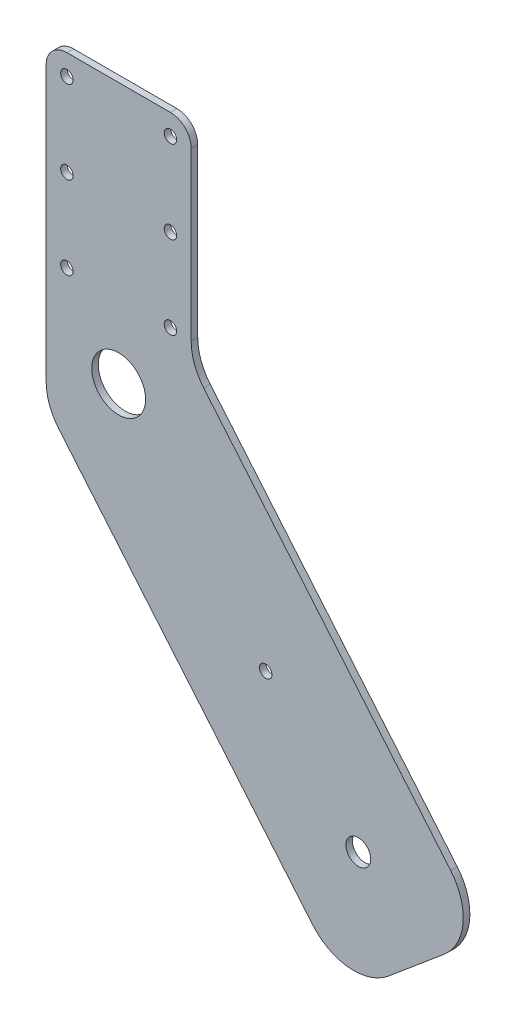
ISO-10303-21;
HEADER;
FILE_DESCRIPTION(('STEP AP214'),'2;1');
FILE_NAME('part.step','',(''),(''),'','','');
FILE_SCHEMA(('AUTOMOTIVE_DESIGN { 1 0 10303 214 1 1 1 1 }'));
ENDSEC;
DATA;
#1=APPLICATION_CONTEXT('core data for automotive mechanical design processes');
#2=APPLICATION_PROTOCOL_DEFINITION('international standard','automotive_design',2000,#1);
#3=PRODUCT_CONTEXT('',#1,'mechanical');
#4=PRODUCT('Part','Part','',(#3));
#5=PRODUCT_RELATED_PRODUCT_CATEGORY('part','',(#4));
#6=PRODUCT_DEFINITION_FORMATION('','',#4);
#7=PRODUCT_DEFINITION_CONTEXT('part definition',#1,'design');
#8=PRODUCT_DEFINITION('design','',#6,#7);
#9=PRODUCT_DEFINITION_SHAPE('','',#8);
#10=(LENGTH_UNIT() NAMED_UNIT(*) SI_UNIT(.MILLI.,.METRE.));
#11=(NAMED_UNIT(*) PLANE_ANGLE_UNIT() SI_UNIT($,.RADIAN.));
#12=(NAMED_UNIT(*) SI_UNIT($,.STERADIAN.) SOLID_ANGLE_UNIT());
#13=UNCERTAINTY_MEASURE_WITH_UNIT(LENGTH_MEASURE(1.E-05),#10,'distance_accuracy_value','');
#14=(GEOMETRIC_REPRESENTATION_CONTEXT(3) GLOBAL_UNCERTAINTY_ASSIGNED_CONTEXT((#13)) GLOBAL_UNIT_ASSIGNED_CONTEXT((#10,
#11,#12)) REPRESENTATION_CONTEXT('',''));
#15=CARTESIAN_POINT('',(0.,0.,0.));
#16=DIRECTION('',(0.,0.,1.));
#17=DIRECTION('',(1.,0.,0.));
#18=AXIS2_PLACEMENT_3D('',#15,#16,#17);
#19=CARTESIAN_POINT('',(0.,0.,1.5875));
#20=DIRECTION('',(0.,0.,1.));
#21=DIRECTION('',(1.,0.,0.));
#22=AXIS2_PLACEMENT_3D('',#19,#20,#21);
#23=PLANE('',#22);
#24=CARTESIAN_POINT('',(53.0049557524877,-55.3131585729256,1.5875));
#25=DIRECTION('',(0.,0.,1.));
#26=DIRECTION('',(1.,0.,0.));
#27=AXIS2_PLACEMENT_3D('',#24,#25,#26);
#28=CIRCLE('',#27,1.5);
#29=CARTESIAN_POINT('',(54.5049557524877,-55.3131585729256,1.5875));
#30=VERTEX_POINT('',#29);
#31=EDGE_CURVE('E500',#30,#30,#28,.T.);
#32=ORIENTED_EDGE('',*,*,#31,.F.);
#33=EDGE_LOOP('',(#32));
#34=FACE_BOUND('',#33,.T.);
#35=CARTESIAN_POINT('',(30.,25.,1.5875));
#36=DIRECTION('',(0.,0.,1.));
#37=DIRECTION('',(-1.,0.,0.));
#38=AXIS2_PLACEMENT_3D('',#35,#36,#37);
#39=CIRCLE('',#38,1.5);
#40=CARTESIAN_POINT('',(28.5,25.,1.5875));
#41=VERTEX_POINT('',#40);
#42=EDGE_CURVE('E488',#41,#41,#39,.T.);
#43=ORIENTED_EDGE('',*,*,#42,.F.);
#44=EDGE_LOOP('',(#43));
#45=FACE_BOUND('',#44,.T.);
#46=CARTESIAN_POINT('',(5.00000000000001,5.,1.5875));
#47=DIRECTION('',(0.,0.,1.));
#48=DIRECTION('',(1.,0.,0.));
#49=AXIS2_PLACEMENT_3D('',#46,#47,#48);
#50=CIRCLE('',#49,1.5);
#51=CARTESIAN_POINT('',(6.50000000000001,5.,1.5875));
#52=VERTEX_POINT('',#51);
#53=EDGE_CURVE('E476',#52,#52,#50,.T.);
#54=ORIENTED_EDGE('',*,*,#53,.F.);
#55=EDGE_LOOP('',(#54));
#56=FACE_BOUND('',#55,.T.);
#57=CARTESIAN_POINT('',(5.,45.,1.5875));
#58=DIRECTION('',(0.,0.,1.));
#59=DIRECTION('',(1.,0.,0.));
#60=AXIS2_PLACEMENT_3D('',#57,#58,#59);
#61=CIRCLE('',#60,1.5);
#62=CARTESIAN_POINT('',(6.5,45.,1.5875));
#63=VERTEX_POINT('',#62);
#64=EDGE_CURVE('E464',#63,#63,#61,.T.);
#65=ORIENTED_EDGE('',*,*,#64,.F.);
#66=EDGE_LOOP('',(#65));
#67=FACE_BOUND('',#66,.T.);
#68=DIRECTION('',(0.64278760968654,-0.766044443118977,0.));
#69=VECTOR('',#68,1.);
#70=CARTESIAN_POINT('',(0.,-26.,1.5875));
#71=LINE('',#70,#69);
#72=CARTESIAN_POINT('',(3.0414222394533,-29.6246258804644,1.5875));
#73=VERTEX_POINT('',#72);
#74=CARTESIAN_POINT('',(64.3123286807204,-102.644448753348,1.5875));
#75=VERTEX_POINT('',#74);
#76=EDGE_CURVE('E283',#73,#75,#71,.T.);
#77=ORIENTED_EDGE('',*,*,#76,.T.);
#78=CARTESIAN_POINT('',(74.2709064412671,-94.288209827423,1.5875));
#79=DIRECTION('',(0.,0.,1.));
#80=DIRECTION('',(1.,0.,0.));
#81=AXIS2_PLACEMENT_3D('',#78,#79,#80);
#82=CIRCLE('',#81,13.);
#83=CARTESIAN_POINT('',(82.6271453671922,-104.24678758797,1.5875));
#84=VERTEX_POINT('',#83);
#85=EDGE_CURVE('E188',#75,#84,#82,.T.);
#86=ORIENTED_EDGE('',*,*,#85,.T.);
#87=DIRECTION('',(0.766044443118977,0.64278760968654,0.));
#88=VECTOR('',#87,1.);
#89=CARTESIAN_POINT('',(72.6685676066454,-112.603026513895,1.5875));
#90=LINE('',#89,#88);
#91=CARTESIAN_POINT('',(96.0513337444287,-92.9825560717761,1.5875));
#92=VERTEX_POINT('',#91);
#93=EDGE_CURVE('E215',#84,#92,#90,.T.);
#94=ORIENTED_EDGE('',*,*,#93,.T.);
#95=CARTESIAN_POINT('',(87.6950948185036,-83.0239783112294,1.5875));
#96=DIRECTION('',(0.,0.,1.));
#97=DIRECTION('',(1.,0.,0.));
#98=AXIS2_PLACEMENT_3D('',#95,#96,#97);
#99=CIRCLE('',#98,13.);
#100=CARTESIAN_POINT('',(97.6536725790503,-74.6677393853044,1.5875));
#101=VERTEX_POINT('',#100);
#102=EDGE_CURVE('E54',#92,#101,#99,.T.);
#103=ORIENTED_EDGE('',*,*,#102,.T.);
#104=DIRECTION('',(-0.64278760968654,0.766044443118978,0.));
#105=VECTOR('',#104,1.);
#106=CARTESIAN_POINT('',(106.009911504975,-84.6263171458511,1.5875));
#107=LINE('',#106,#105);
#108=CARTESIAN_POINT('',(38.0414222394533,-3.62462588046436,1.5875));
#109=VERTEX_POINT('',#108);
#110=EDGE_CURVE('E210',#101,#109,#107,.T.);
#111=ORIENTED_EDGE('',*,*,#110,.T.);
#112=CARTESIAN_POINT('',(48.,4.73161304546064,1.5875));
#113=DIRECTION('',(0.,0.,1.));
#114=DIRECTION('',(1.,0.,0.));
#115=AXIS2_PLACEMENT_3D('',#112,#113,#114);
#116=CIRCLE('',#115,13.);
#117=CARTESIAN_POINT('',(35.,4.73161304546064,1.5875));
#118=VERTEX_POINT('',#117);
#119=EDGE_CURVE('E11',#109,#118,#116,.F.);
#120=ORIENTED_EDGE('',*,*,#119,.T.);
#121=DIRECTION('',(0.,1.,0.));
#122=VECTOR('',#121,1.);
#123=CARTESIAN_POINT('',(35.,50.,1.5875));
#124=LINE('',#123,#122);
#125=CARTESIAN_POINT('',(35.,45.,1.5875));
#126=VERTEX_POINT('',#125);
#127=EDGE_CURVE('E209',#118,#126,#124,.T.);
#128=ORIENTED_EDGE('',*,*,#127,.T.);
#129=CARTESIAN_POINT('',(30.,45.,1.5875));
#130=DIRECTION('',(0.,0.,1.));
#131=DIRECTION('',(1.,0.,0.));
#132=AXIS2_PLACEMENT_3D('',#129,#130,#131);
#133=CIRCLE('',#132,5.);
#134=CARTESIAN_POINT('',(30.,50.,1.5875));
#135=VERTEX_POINT('',#134);
#136=EDGE_CURVE('E164',#126,#135,#133,.T.);
#137=ORIENTED_EDGE('',*,*,#136,.T.);
#138=DIRECTION('',(-1.,0.,0.));
#139=VECTOR('',#138,1.);
#140=CARTESIAN_POINT('',(0.,50.,1.5875));
#141=LINE('',#140,#139);
#142=CARTESIAN_POINT('',(5.,50.,1.5875));
#143=VERTEX_POINT('',#142);
#144=EDGE_CURVE('E142',#135,#143,#141,.T.);
#145=ORIENTED_EDGE('',*,*,#144,.T.);
#146=CARTESIAN_POINT('',(5.,45.,1.5875));
#147=DIRECTION('',(0.,0.,1.));
#148=DIRECTION('',(1.,0.,0.));
#149=AXIS2_PLACEMENT_3D('',#146,#147,#148);
#150=CIRCLE('',#149,5.);
#151=CARTESIAN_POINT('',(0.,45.,1.5875));
#152=VERTEX_POINT('',#151);
#153=EDGE_CURVE('E162',#143,#152,#150,.T.);
#154=ORIENTED_EDGE('',*,*,#153,.T.);
#155=DIRECTION('',(0.,-1.,0.));
#156=VECTOR('',#155,1.);
#157=CARTESIAN_POINT('',(0.,0.,1.5875));
#158=LINE('',#157,#156);
#159=CARTESIAN_POINT('',(0.,-21.2683869545394,1.5875));
#160=VERTEX_POINT('',#159);
#161=EDGE_CURVE('E153',#152,#160,#158,.T.);
#162=ORIENTED_EDGE('',*,*,#161,.T.);
#163=CARTESIAN_POINT('',(13.,-21.2683869545394,1.5875));
#164=DIRECTION('',(0.,0.,1.));
#165=DIRECTION('',(1.,0.,0.));
#166=AXIS2_PLACEMENT_3D('',#163,#164,#165);
#167=CIRCLE('',#166,13.);
#168=EDGE_CURVE('E185',#160,#73,#167,.T.);
#169=ORIENTED_EDGE('',*,*,#168,.T.);
#170=EDGE_LOOP('',(#77,#86,#94,#103,#111,#120,#128,#137,#145,#154,#162,#169));
#171=FACE_BOUND('',#170,.T.);
#172=CARTESIAN_POINT('',(17.5,-13.,1.5875));
#173=DIRECTION('',(0.,0.,1.));
#174=DIRECTION('',(1.,0.,0.));
#175=AXIS2_PLACEMENT_3D('',#172,#173,#174);
#176=CIRCLE('',#175,6.50000000000001);
#177=CARTESIAN_POINT('',(24.,-13.,1.5875));
#178=VERTEX_POINT('',#177);
#179=EDGE_CURVE('E222',#178,#178,#176,.T.);
#180=ORIENTED_EDGE('',*,*,#179,.F.);
#181=EDGE_LOOP('',(#180));
#182=FACE_BOUND('',#181,.T.);
#183=CARTESIAN_POINT('',(5.,25.,1.5875));
#184=DIRECTION('',(0.,0.,1.));
#185=DIRECTION('',(1.,0.,0.));
#186=AXIS2_PLACEMENT_3D('',#183,#184,#185);
#187=CIRCLE('',#186,1.5);
#188=CARTESIAN_POINT('',(6.5,25.,1.5875));
#189=VERTEX_POINT('',#188);
#190=EDGE_CURVE('E470',#189,#189,#187,.T.);
#191=ORIENTED_EDGE('',*,*,#190,.F.);
#192=EDGE_LOOP('',(#191));
#193=FACE_BOUND('',#192,.T.);
#194=CARTESIAN_POINT('',(30.,5.00000000000001,1.5875));
#195=DIRECTION('',(0.,0.,1.));
#196=DIRECTION('',(-1.,0.,0.));
#197=AXIS2_PLACEMENT_3D('',#194,#195,#196);
#198=CIRCLE('',#197,1.5);
#199=CARTESIAN_POINT('',(28.5,5.00000000000001,1.5875));
#200=VERTEX_POINT('',#199);
#201=EDGE_CURVE('E482',#200,#200,#198,.T.);
#202=ORIENTED_EDGE('',*,*,#201,.F.);
#203=EDGE_LOOP('',(#202));
#204=FACE_BOUND('',#203,.T.);
#205=CARTESIAN_POINT('',(30.,45.,1.5875));
#206=DIRECTION('',(0.,0.,1.));
#207=DIRECTION('',(-1.,0.,0.));
#208=AXIS2_PLACEMENT_3D('',#205,#206,#207);
#209=CIRCLE('',#208,1.5);
#210=CARTESIAN_POINT('',(28.5,45.,1.5875));
#211=VERTEX_POINT('',#210);
#212=EDGE_CURVE('E494',#211,#211,#209,.T.);
#213=ORIENTED_EDGE('',*,*,#212,.F.);
#214=EDGE_LOOP('',(#213));
#215=FACE_BOUND('',#214,.T.);
#216=CARTESIAN_POINT('',(75.3508848717886,-81.9439998807079,1.5875));
#217=DIRECTION('',(0.,0.,1.));
#218=DIRECTION('',(1.,0.,0.));
#219=AXIS2_PLACEMENT_3D('',#216,#217,#218);
#220=CIRCLE('',#219,3.00000000000001);
#221=CARTESIAN_POINT('',(78.3508848717886,-81.9439998807079,1.5875));
#222=VERTEX_POINT('',#221);
#223=EDGE_CURVE('E506',#222,#222,#220,.T.);
#224=ORIENTED_EDGE('',*,*,#223,.F.);
#225=EDGE_LOOP('',(#224));
#226=FACE_BOUND('',#225,.T.);
#227=ADVANCED_FACE('F32',(#34,#45,#56,#67,#171,#182,#193,#204,#215,#226),#23,.T.);
#228=CARTESIAN_POINT('',(0.,0.,0.));
#229=DIRECTION('',(0.,0.,1.));
#230=DIRECTION('',(1.,0.,0.));
#231=AXIS2_PLACEMENT_3D('',#228,#229,#230);
#232=PLANE('',#231);
#233=DIRECTION('',(0.766044443118977,0.64278760968654,0.));
#234=VECTOR('',#233,1.);
#235=CARTESIAN_POINT('',(72.6685676066454,-112.603026513895,0.));
#236=LINE('',#235,#234);
#237=CARTESIAN_POINT('',(82.6271453671922,-104.24678758797,0.));
#238=VERTEX_POINT('',#237);
#239=CARTESIAN_POINT('',(96.0513337444287,-92.9825560717761,0.));
#240=VERTEX_POINT('',#239);
#241=EDGE_CURVE('E203',#238,#240,#236,.T.);
#242=ORIENTED_EDGE('',*,*,#241,.F.);
#243=CARTESIAN_POINT('',(74.2709064412671,-94.288209827423,0.));
#244=DIRECTION('',(0.,0.,1.));
#245=DIRECTION('',(1.,0.,0.));
#246=AXIS2_PLACEMENT_3D('',#243,#244,#245);
#247=CIRCLE('',#246,13.);
#248=CARTESIAN_POINT('',(64.3123286807204,-102.644448753348,0.));
#249=VERTEX_POINT('',#248);
#250=EDGE_CURVE('E178',#238,#249,#247,.F.);
#251=ORIENTED_EDGE('',*,*,#250,.T.);
#252=DIRECTION('',(0.64278760968654,-0.766044443118977,0.));
#253=VECTOR('',#252,1.);
#254=CARTESIAN_POINT('',(0.,-26.,0.));
#255=LINE('',#254,#253);
#256=CARTESIAN_POINT('',(3.0414222394533,-29.6246258804644,0.));
#257=VERTEX_POINT('',#256);
#258=EDGE_CURVE('E219',#257,#249,#255,.T.);
#259=ORIENTED_EDGE('',*,*,#258,.F.);
#260=CARTESIAN_POINT('',(13.,-21.2683869545394,0.));
#261=DIRECTION('',(0.,0.,1.));
#262=DIRECTION('',(1.,0.,0.));
#263=AXIS2_PLACEMENT_3D('',#260,#261,#262);
#264=CIRCLE('',#263,13.);
#265=CARTESIAN_POINT('',(0.,-21.2683869545394,0.));
#266=VERTEX_POINT('',#265);
#267=EDGE_CURVE('E174',#257,#266,#264,.F.);
#268=ORIENTED_EDGE('',*,*,#267,.T.);
#269=DIRECTION('',(0.,-1.,0.));
#270=VECTOR('',#269,1.);
#271=CARTESIAN_POINT('',(0.,0.,0.));
#272=LINE('',#271,#270);
#273=CARTESIAN_POINT('',(0.,45.,0.));
#274=VERTEX_POINT('',#273);
#275=EDGE_CURVE('E149',#274,#266,#272,.T.);
#276=ORIENTED_EDGE('',*,*,#275,.F.);
#277=CARTESIAN_POINT('',(5.,45.,0.));
#278=DIRECTION('',(0.,0.,1.));
#279=DIRECTION('',(1.,0.,0.));
#280=AXIS2_PLACEMENT_3D('',#277,#278,#279);
#281=CIRCLE('',#280,5.);
#282=CARTESIAN_POINT('',(5.,50.,0.));
#283=VERTEX_POINT('',#282);
#284=EDGE_CURVE('E133',#274,#283,#281,.F.);
#285=ORIENTED_EDGE('',*,*,#284,.T.);
#286=DIRECTION('',(-1.,0.,0.));
#287=VECTOR('',#286,1.);
#288=CARTESIAN_POINT('',(0.,50.,0.));
#289=LINE('',#288,#287);
#290=CARTESIAN_POINT('',(30.,50.,0.));
#291=VERTEX_POINT('',#290);
#292=EDGE_CURVE('E139',#291,#283,#289,.T.);
#293=ORIENTED_EDGE('',*,*,#292,.F.);
#294=CARTESIAN_POINT('',(30.,45.,0.));
#295=DIRECTION('',(0.,0.,1.));
#296=DIRECTION('',(1.,0.,0.));
#297=AXIS2_PLACEMENT_3D('',#294,#295,#296);
#298=CIRCLE('',#297,5.);
#299=CARTESIAN_POINT('',(35.,45.,0.));
#300=VERTEX_POINT('',#299);
#301=EDGE_CURVE('E123',#291,#300,#298,.F.);
#302=ORIENTED_EDGE('',*,*,#301,.T.);
#303=DIRECTION('',(0.,1.,0.));
#304=VECTOR('',#303,1.);
#305=CARTESIAN_POINT('',(35.,50.,0.));
#306=LINE('',#305,#304);
#307=CARTESIAN_POINT('',(35.,4.73161304546064,0.));
#308=VERTEX_POINT('',#307);
#309=EDGE_CURVE('E150',#308,#300,#306,.T.);
#310=ORIENTED_EDGE('',*,*,#309,.F.);
#311=CARTESIAN_POINT('',(48.,4.73161304546064,0.));
#312=DIRECTION('',(0.,0.,1.));
#313=DIRECTION('',(1.,0.,0.));
#314=AXIS2_PLACEMENT_3D('',#311,#312,#313);
#315=CIRCLE('',#314,13.);
#316=CARTESIAN_POINT('',(38.0414222394533,-3.62462588046436,0.));
#317=VERTEX_POINT('',#316);
#318=EDGE_CURVE('E40',#308,#317,#315,.T.);
#319=ORIENTED_EDGE('',*,*,#318,.T.);
#320=DIRECTION('',(-0.64278760968654,0.766044443118978,0.));
#321=VECTOR('',#320,1.);
#322=CARTESIAN_POINT('',(106.009911504975,-84.6263171458511,0.));
#323=LINE('',#322,#321);
#324=CARTESIAN_POINT('',(97.6536725790503,-74.6677393853044,0.));
#325=VERTEX_POINT('',#324);
#326=EDGE_CURVE('E155',#325,#317,#323,.T.);
#327=ORIENTED_EDGE('',*,*,#326,.F.);
#328=CARTESIAN_POINT('',(87.6950948185036,-83.0239783112294,0.));
#329=DIRECTION('',(0.,0.,1.));
#330=DIRECTION('',(1.,0.,0.));
#331=AXIS2_PLACEMENT_3D('',#328,#329,#330);
#332=CIRCLE('',#331,13.);
#333=EDGE_CURVE('E176',#325,#240,#332,.F.);
#334=ORIENTED_EDGE('',*,*,#333,.T.);
#335=EDGE_LOOP('',(#242,#251,#259,#268,#276,#285,#293,#302,#310,#319,#327,#334));
#336=FACE_BOUND('',#335,.T.);
#337=CARTESIAN_POINT('',(17.5,-13.,0.));
#338=DIRECTION('',(0.,0.,1.));
#339=DIRECTION('',(1.,0.,0.));
#340=AXIS2_PLACEMENT_3D('',#337,#338,#339);
#341=CIRCLE('',#340,6.50000000000001);
#342=CARTESIAN_POINT('',(24.,-13.,0.));
#343=VERTEX_POINT('',#342);
#344=EDGE_CURVE('E287',#343,#343,#341,.T.);
#345=ORIENTED_EDGE('',*,*,#344,.T.);
#346=EDGE_LOOP('',(#345));
#347=FACE_BOUND('',#346,.T.);
#348=CARTESIAN_POINT('',(5.,45.,0.));
#349=DIRECTION('',(0.,0.,1.));
#350=DIRECTION('',(1.,0.,0.));
#351=AXIS2_PLACEMENT_3D('',#348,#349,#350);
#352=CIRCLE('',#351,1.5);
#353=CARTESIAN_POINT('',(6.5,45.,0.));
#354=VERTEX_POINT('',#353);
#355=EDGE_CURVE('E466',#354,#354,#352,.T.);
#356=ORIENTED_EDGE('',*,*,#355,.T.);
#357=EDGE_LOOP('',(#356));
#358=FACE_BOUND('',#357,.T.);
#359=CARTESIAN_POINT('',(5.,25.,0.));
#360=DIRECTION('',(0.,0.,1.));
#361=DIRECTION('',(1.,0.,0.));
#362=AXIS2_PLACEMENT_3D('',#359,#360,#361);
#363=CIRCLE('',#362,1.5);
#364=CARTESIAN_POINT('',(6.5,25.,0.));
#365=VERTEX_POINT('',#364);
#366=EDGE_CURVE('E473',#365,#365,#363,.T.);
#367=ORIENTED_EDGE('',*,*,#366,.T.);
#368=EDGE_LOOP('',(#367));
#369=FACE_BOUND('',#368,.T.);
#370=CARTESIAN_POINT('',(5.00000000000001,5.,0.));
#371=DIRECTION('',(0.,0.,1.));
#372=DIRECTION('',(1.,0.,0.));
#373=AXIS2_PLACEMENT_3D('',#370,#371,#372);
#374=CIRCLE('',#373,1.5);
#375=CARTESIAN_POINT('',(6.50000000000001,5.,0.));
#376=VERTEX_POINT('',#375);
#377=EDGE_CURVE('E479',#376,#376,#374,.T.);
#378=ORIENTED_EDGE('',*,*,#377,.T.);
#379=EDGE_LOOP('',(#378));
#380=FACE_BOUND('',#379,.T.);
#381=CARTESIAN_POINT('',(30.,5.00000000000001,0.));
#382=DIRECTION('',(0.,0.,1.));
#383=DIRECTION('',(-1.,0.,0.));
#384=AXIS2_PLACEMENT_3D('',#381,#382,#383);
#385=CIRCLE('',#384,1.5);
#386=CARTESIAN_POINT('',(28.5,5.00000000000001,0.));
#387=VERTEX_POINT('',#386);
#388=EDGE_CURVE('E485',#387,#387,#385,.T.);
#389=ORIENTED_EDGE('',*,*,#388,.T.);
#390=EDGE_LOOP('',(#389));
#391=FACE_BOUND('',#390,.T.);
#392=CARTESIAN_POINT('',(30.,25.,0.));
#393=DIRECTION('',(0.,0.,1.));
#394=DIRECTION('',(-1.,0.,0.));
#395=AXIS2_PLACEMENT_3D('',#392,#393,#394);
#396=CIRCLE('',#395,1.5);
#397=CARTESIAN_POINT('',(28.5,25.,0.));
#398=VERTEX_POINT('',#397);
#399=EDGE_CURVE('E491',#398,#398,#396,.T.);
#400=ORIENTED_EDGE('',*,*,#399,.T.);
#401=EDGE_LOOP('',(#400));
#402=FACE_BOUND('',#401,.T.);
#403=CARTESIAN_POINT('',(30.,45.,0.));
#404=DIRECTION('',(0.,0.,1.));
#405=DIRECTION('',(-1.,0.,0.));
#406=AXIS2_PLACEMENT_3D('',#403,#404,#405);
#407=CIRCLE('',#406,1.5);
#408=CARTESIAN_POINT('',(28.5,45.,0.));
#409=VERTEX_POINT('',#408);
#410=EDGE_CURVE('E497',#409,#409,#407,.T.);
#411=ORIENTED_EDGE('',*,*,#410,.T.);
#412=EDGE_LOOP('',(#411));
#413=FACE_BOUND('',#412,.T.);
#414=CARTESIAN_POINT('',(53.0049557524877,-55.3131585729256,0.));
#415=DIRECTION('',(0.,0.,1.));
#416=DIRECTION('',(1.,0.,0.));
#417=AXIS2_PLACEMENT_3D('',#414,#415,#416);
#418=CIRCLE('',#417,1.5);
#419=CARTESIAN_POINT('',(54.5049557524877,-55.3131585729256,0.));
#420=VERTEX_POINT('',#419);
#421=EDGE_CURVE('E503',#420,#420,#418,.T.);
#422=ORIENTED_EDGE('',*,*,#421,.T.);
#423=EDGE_LOOP('',(#422));
#424=FACE_BOUND('',#423,.T.);
#425=CARTESIAN_POINT('',(75.3508848717886,-81.9439998807079,0.));
#426=DIRECTION('',(0.,0.,1.));
#427=DIRECTION('',(1.,0.,0.));
#428=AXIS2_PLACEMENT_3D('',#425,#426,#427);
#429=CIRCLE('',#428,3.00000000000001);
#430=CARTESIAN_POINT('',(78.3508848717886,-81.9439998807079,0.));
#431=VERTEX_POINT('',#430);
#432=EDGE_CURVE('E509',#431,#431,#429,.T.);
#433=ORIENTED_EDGE('',*,*,#432,.T.);
#434=EDGE_LOOP('',(#433));
#435=FACE_BOUND('',#434,.T.);
#436=ADVANCED_FACE('F146',(#336,#347,#358,#369,#380,#391,#402,#413,#424,#435),#232,.F.);
#437=CARTESIAN_POINT('',(0.,-26.,1.5875));
#438=DIRECTION('',(0.766044443118977,0.64278760968654,0.));
#439=DIRECTION('',(-0.64278760968654,0.766044443118977,0.));
#440=AXIS2_PLACEMENT_3D('',#437,#438,#439);
#441=PLANE('',#440);
#442=ORIENTED_EDGE('',*,*,#258,.T.);
#443=DIRECTION('',(0.,0.,-1.));
#444=VECTOR('',#443,1.);
#445=CARTESIAN_POINT('',(64.3123286807204,-102.644448753348,1.5875));
#446=LINE('',#445,#444);
#447=EDGE_CURVE('E183',#249,#75,#446,.F.);
#448=ORIENTED_EDGE('',*,*,#447,.T.);
#449=ORIENTED_EDGE('',*,*,#76,.F.);
#450=DIRECTION('',(0.,0.,-1.));
#451=VECTOR('',#450,1.);
#452=CARTESIAN_POINT('',(3.0414222394533,-29.6246258804644,1.5875));
#453=LINE('',#452,#451);
#454=EDGE_CURVE('E180',#73,#257,#453,.T.);
#455=ORIENTED_EDGE('',*,*,#454,.T.);
#456=EDGE_LOOP('',(#442,#448,#449,#455));
#457=FACE_BOUND('',#456,.T.);
#458=ADVANCED_FACE('F247',(#457),#441,.F.);
#459=CARTESIAN_POINT('',(72.6685676066454,-112.603026513895,1.5875));
#460=DIRECTION('',(-0.64278760968654,0.766044443118977,0.));
#461=DIRECTION('',(-0.766044443118977,-0.64278760968654,0.));
#462=AXIS2_PLACEMENT_3D('',#459,#460,#461);
#463=PLANE('',#462);
#464=ORIENTED_EDGE('',*,*,#93,.F.);
#465=DIRECTION('',(0.,0.,-1.));
#466=VECTOR('',#465,1.);
#467=CARTESIAN_POINT('',(82.6271453671922,-104.24678758797,1.5875));
#468=LINE('',#467,#466);
#469=EDGE_CURVE('E171',#84,#238,#468,.T.);
#470=ORIENTED_EDGE('',*,*,#469,.T.);
#471=ORIENTED_EDGE('',*,*,#241,.T.);
#472=DIRECTION('',(0.,0.,-1.));
#473=VECTOR('',#472,1.);
#474=CARTESIAN_POINT('',(96.0513337444287,-92.9825560717761,1.5875));
#475=LINE('',#474,#473);
#476=EDGE_CURVE('E169',#240,#92,#475,.F.);
#477=ORIENTED_EDGE('',*,*,#476,.T.);
#478=EDGE_LOOP('',(#464,#470,#471,#477));
#479=FACE_BOUND('',#478,.T.);
#480=ADVANCED_FACE('F227',(#479),#463,.F.);
#481=CARTESIAN_POINT('',(106.009911504975,-84.6263171458511,1.5875));
#482=DIRECTION('',(-0.766044443118977,-0.64278760968654,0.));
#483=DIRECTION('',(0.64278760968654,-0.766044443118978,0.));
#484=AXIS2_PLACEMENT_3D('',#481,#482,#483);
#485=PLANE('',#484);
#486=ORIENTED_EDGE('',*,*,#110,.F.);
#487=DIRECTION('',(0.,0.,-1.));
#488=VECTOR('',#487,1.);
#489=CARTESIAN_POINT('',(97.6536725790503,-74.6677393853044,1.5875));
#490=LINE('',#489,#488);
#491=EDGE_CURVE('E191',#101,#325,#490,.T.);
#492=ORIENTED_EDGE('',*,*,#491,.T.);
#493=ORIENTED_EDGE('',*,*,#326,.T.);
#494=DIRECTION('',(0.,0.,-1.));
#495=VECTOR('',#494,1.);
#496=CARTESIAN_POINT('',(38.0414222394533,-3.62462588046437,1.5875));
#497=LINE('',#496,#495);
#498=EDGE_CURVE('E47',#317,#109,#497,.F.);
#499=ORIENTED_EDGE('',*,*,#498,.T.);
#500=EDGE_LOOP('',(#486,#492,#493,#499));
#501=FACE_BOUND('',#500,.T.);
#502=ADVANCED_FACE('F201',(#501),#485,.F.);
#503=CARTESIAN_POINT('',(35.,50.,1.5875));
#504=DIRECTION('',(-1.,0.,0.));
#505=DIRECTION('',(0.,-1.,0.));
#506=AXIS2_PLACEMENT_3D('',#503,#504,#505);
#507=PLANE('',#506);
#508=ORIENTED_EDGE('',*,*,#127,.F.);
#509=DIRECTION('',(0.,0.,-1.));
#510=VECTOR('',#509,1.);
#511=CARTESIAN_POINT('',(35.,4.73161304546064,0.));
#512=LINE('',#511,#510);
#513=EDGE_CURVE('E194',#118,#308,#512,.T.);
#514=ORIENTED_EDGE('',*,*,#513,.T.);
#515=ORIENTED_EDGE('',*,*,#309,.T.);
#516=DIRECTION('',(0.,0.,-1.));
#517=VECTOR('',#516,1.);
#518=CARTESIAN_POINT('',(35.,45.,1.5875));
#519=LINE('',#518,#517);
#520=EDGE_CURVE('E129',#300,#126,#519,.F.);
#521=ORIENTED_EDGE('',*,*,#520,.T.);
#522=EDGE_LOOP('',(#508,#514,#515,#521));
#523=FACE_BOUND('',#522,.T.);
#524=ADVANCED_FACE('F212',(#523),#507,.F.);
#525=CARTESIAN_POINT('',(0.,50.,1.5875));
#526=DIRECTION('',(0.,-1.,0.));
#527=DIRECTION('',(1.,0.,0.));
#528=AXIS2_PLACEMENT_3D('',#525,#526,#527);
#529=PLANE('',#528);
#530=ORIENTED_EDGE('',*,*,#144,.F.);
#531=DIRECTION('',(0.,0.,-1.));
#532=VECTOR('',#531,1.);
#533=CARTESIAN_POINT('',(30.,50.,1.5875));
#534=LINE('',#533,#532);
#535=EDGE_CURVE('E127',#135,#291,#534,.T.);
#536=ORIENTED_EDGE('',*,*,#535,.T.);
#537=ORIENTED_EDGE('',*,*,#292,.T.);
#538=DIRECTION('',(0.,0.,-1.));
#539=VECTOR('',#538,1.);
#540=CARTESIAN_POINT('',(5.,50.,1.5875));
#541=LINE('',#540,#539);
#542=EDGE_CURVE('E143',#283,#143,#541,.F.);
#543=ORIENTED_EDGE('',*,*,#542,.T.);
#544=EDGE_LOOP('',(#530,#536,#537,#543));
#545=FACE_BOUND('',#544,.T.);
#546=ADVANCED_FACE('F138',(#545),#529,.F.);
#547=CARTESIAN_POINT('',(0.,0.,1.5875));
#548=DIRECTION('',(1.,0.,0.));
#549=DIRECTION('',(0.,0.,-1.));
#550=AXIS2_PLACEMENT_3D('',#547,#548,#549);
#551=PLANE('',#550);
#552=ORIENTED_EDGE('',*,*,#275,.T.);
#553=DIRECTION('',(0.,0.,-1.));
#554=VECTOR('',#553,1.);
#555=CARTESIAN_POINT('',(0.,-21.2683869545394,1.5875));
#556=LINE('',#555,#554);
#557=EDGE_CURVE('E197',#266,#160,#556,.F.);
#558=ORIENTED_EDGE('',*,*,#557,.T.);
#559=ORIENTED_EDGE('',*,*,#161,.F.);
#560=DIRECTION('',(0.,0.,-1.));
#561=VECTOR('',#560,1.);
#562=CARTESIAN_POINT('',(0.,45.,1.5875));
#563=LINE('',#562,#561);
#564=EDGE_CURVE('E166',#152,#274,#563,.T.);
#565=ORIENTED_EDGE('',*,*,#564,.T.);
#566=EDGE_LOOP('',(#552,#558,#559,#565));
#567=FACE_BOUND('',#566,.T.);
#568=ADVANCED_FACE('F255',(#567),#551,.F.);
#569=CARTESIAN_POINT('',(17.5,-13.,1.5875));
#570=DIRECTION('',(0.,0.,-1.));
#571=DIRECTION('',(-1.,0.,0.));
#572=AXIS2_PLACEMENT_3D('',#569,#570,#571);
#573=CYLINDRICAL_SURFACE('',#572,6.50000000000001);
#574=ORIENTED_EDGE('',*,*,#179,.T.);
#575=EDGE_LOOP('',(#574));
#576=FACE_BOUND('',#575,.T.);
#577=ORIENTED_EDGE('',*,*,#344,.F.);
#578=EDGE_LOOP('',(#577));
#579=FACE_BOUND('',#578,.T.);
#580=ADVANCED_FACE('F252',(#576,#579),#573,.F.);
#581=CARTESIAN_POINT('',(5.,45.,1.5875));
#582=DIRECTION('',(0.,0.,-1.));
#583=DIRECTION('',(-1.,0.,0.));
#584=AXIS2_PLACEMENT_3D('',#581,#582,#583);
#585=CYLINDRICAL_SURFACE('',#584,1.5);
#586=ORIENTED_EDGE('',*,*,#64,.T.);
#587=EDGE_LOOP('',(#586));
#588=FACE_BOUND('',#587,.T.);
#589=ORIENTED_EDGE('',*,*,#355,.F.);
#590=EDGE_LOOP('',(#589));
#591=FACE_BOUND('',#590,.T.);
#592=ADVANCED_FACE('F440',(#588,#591),#585,.F.);
#593=CARTESIAN_POINT('',(5.,25.,1.5875));
#594=DIRECTION('',(0.,0.,-1.));
#595=DIRECTION('',(-1.,0.,0.));
#596=AXIS2_PLACEMENT_3D('',#593,#594,#595);
#597=CYLINDRICAL_SURFACE('',#596,1.5);
#598=ORIENTED_EDGE('',*,*,#190,.T.);
#599=EDGE_LOOP('',(#598));
#600=FACE_BOUND('',#599,.T.);
#601=ORIENTED_EDGE('',*,*,#366,.F.);
#602=EDGE_LOOP('',(#601));
#603=FACE_BOUND('',#602,.T.);
#604=ADVANCED_FACE('F430',(#600,#603),#597,.F.);
#605=CARTESIAN_POINT('',(5.00000000000001,5.,1.5875));
#606=DIRECTION('',(0.,0.,-1.));
#607=DIRECTION('',(-1.,0.,0.));
#608=AXIS2_PLACEMENT_3D('',#605,#606,#607);
#609=CYLINDRICAL_SURFACE('',#608,1.5);
#610=ORIENTED_EDGE('',*,*,#53,.T.);
#611=EDGE_LOOP('',(#610));
#612=FACE_BOUND('',#611,.T.);
#613=ORIENTED_EDGE('',*,*,#377,.F.);
#614=EDGE_LOOP('',(#613));
#615=FACE_BOUND('',#614,.T.);
#616=ADVANCED_FACE('F420',(#612,#615),#609,.F.);
#617=CARTESIAN_POINT('',(30.,5.00000000000001,1.5875));
#618=DIRECTION('',(0.,0.,-1.));
#619=DIRECTION('',(-1.,0.,0.));
#620=AXIS2_PLACEMENT_3D('',#617,#618,#619);
#621=CYLINDRICAL_SURFACE('',#620,1.5);
#622=ORIENTED_EDGE('',*,*,#201,.T.);
#623=EDGE_LOOP('',(#622));
#624=FACE_BOUND('',#623,.T.);
#625=ORIENTED_EDGE('',*,*,#388,.F.);
#626=EDGE_LOOP('',(#625));
#627=FACE_BOUND('',#626,.T.);
#628=ADVANCED_FACE('F410',(#624,#627),#621,.F.);
#629=CARTESIAN_POINT('',(30.,25.,1.5875));
#630=DIRECTION('',(0.,0.,-1.));
#631=DIRECTION('',(-1.,0.,0.));
#632=AXIS2_PLACEMENT_3D('',#629,#630,#631);
#633=CYLINDRICAL_SURFACE('',#632,1.5);
#634=ORIENTED_EDGE('',*,*,#42,.T.);
#635=EDGE_LOOP('',(#634));
#636=FACE_BOUND('',#635,.T.);
#637=ORIENTED_EDGE('',*,*,#399,.F.);
#638=EDGE_LOOP('',(#637));
#639=FACE_BOUND('',#638,.T.);
#640=ADVANCED_FACE('F400',(#636,#639),#633,.F.);
#641=CARTESIAN_POINT('',(30.,45.,1.5875));
#642=DIRECTION('',(0.,0.,-1.));
#643=DIRECTION('',(-1.,0.,0.));
#644=AXIS2_PLACEMENT_3D('',#641,#642,#643);
#645=CYLINDRICAL_SURFACE('',#644,1.5);
#646=ORIENTED_EDGE('',*,*,#212,.T.);
#647=EDGE_LOOP('',(#646));
#648=FACE_BOUND('',#647,.T.);
#649=ORIENTED_EDGE('',*,*,#410,.F.);
#650=EDGE_LOOP('',(#649));
#651=FACE_BOUND('',#650,.T.);
#652=ADVANCED_FACE('F390',(#648,#651),#645,.F.);
#653=CARTESIAN_POINT('',(53.0049557524877,-55.3131585729256,1.5875));
#654=DIRECTION('',(0.,0.,-1.));
#655=DIRECTION('',(-1.,0.,0.));
#656=AXIS2_PLACEMENT_3D('',#653,#654,#655);
#657=CYLINDRICAL_SURFACE('',#656,1.5);
#658=ORIENTED_EDGE('',*,*,#31,.T.);
#659=EDGE_LOOP('',(#658));
#660=FACE_BOUND('',#659,.T.);
#661=ORIENTED_EDGE('',*,*,#421,.F.);
#662=EDGE_LOOP('',(#661));
#663=FACE_BOUND('',#662,.T.);
#664=ADVANCED_FACE('F380',(#660,#663),#657,.F.);
#665=CARTESIAN_POINT('',(75.3508848717886,-81.9439998807079,1.5875));
#666=DIRECTION('',(0.,0.,-1.));
#667=DIRECTION('',(-1.,0.,0.));
#668=AXIS2_PLACEMENT_3D('',#665,#666,#667);
#669=CYLINDRICAL_SURFACE('',#668,3.00000000000001);
#670=ORIENTED_EDGE('',*,*,#223,.T.);
#671=EDGE_LOOP('',(#670));
#672=FACE_BOUND('',#671,.T.);
#673=ORIENTED_EDGE('',*,*,#432,.F.);
#674=EDGE_LOOP('',(#673));
#675=FACE_BOUND('',#674,.T.);
#676=ADVANCED_FACE('F272',(#672,#675),#669,.F.);
#677=CARTESIAN_POINT('',(30.,45.,1.5875));
#678=DIRECTION('',(0.,0.,-1.));
#679=DIRECTION('',(-1.,0.,0.));
#680=AXIS2_PLACEMENT_3D('',#677,#678,#679);
#681=CYLINDRICAL_SURFACE('',#680,5.);
#682=ORIENTED_EDGE('',*,*,#136,.F.);
#683=ORIENTED_EDGE('',*,*,#520,.F.);
#684=ORIENTED_EDGE('',*,*,#301,.F.);
#685=ORIENTED_EDGE('',*,*,#535,.F.);
#686=EDGE_LOOP('',(#682,#683,#684,#685));
#687=FACE_BOUND('',#686,.T.);
#688=ADVANCED_FACE('F126',(#687),#681,.T.);
#689=CARTESIAN_POINT('',(5.,45.,1.5875));
#690=DIRECTION('',(0.,0.,-1.));
#691=DIRECTION('',(-1.,0.,0.));
#692=AXIS2_PLACEMENT_3D('',#689,#690,#691);
#693=CYLINDRICAL_SURFACE('',#692,5.);
#694=ORIENTED_EDGE('',*,*,#153,.F.);
#695=ORIENTED_EDGE('',*,*,#542,.F.);
#696=ORIENTED_EDGE('',*,*,#284,.F.);
#697=ORIENTED_EDGE('',*,*,#564,.F.);
#698=EDGE_LOOP('',(#694,#695,#696,#697));
#699=FACE_BOUND('',#698,.T.);
#700=ADVANCED_FACE('F238',(#699),#693,.T.);
#701=CARTESIAN_POINT('',(74.2709064412671,-94.288209827423,1.5875));
#702=DIRECTION('',(0.,0.,-1.));
#703=DIRECTION('',(-1.,0.,0.));
#704=AXIS2_PLACEMENT_3D('',#701,#702,#703);
#705=CYLINDRICAL_SURFACE('',#704,13.);
#706=ORIENTED_EDGE('',*,*,#85,.F.);
#707=ORIENTED_EDGE('',*,*,#447,.F.);
#708=ORIENTED_EDGE('',*,*,#250,.F.);
#709=ORIENTED_EDGE('',*,*,#469,.F.);
#710=EDGE_LOOP('',(#706,#707,#708,#709));
#711=FACE_BOUND('',#710,.T.);
#712=ADVANCED_FACE('F232',(#711),#705,.T.);
#713=CARTESIAN_POINT('',(87.6950948185036,-83.0239783112294,1.5875));
#714=DIRECTION('',(0.,0.,-1.));
#715=DIRECTION('',(-1.,0.,0.));
#716=AXIS2_PLACEMENT_3D('',#713,#714,#715);
#717=CYLINDRICAL_SURFACE('',#716,13.);
#718=ORIENTED_EDGE('',*,*,#102,.F.);
#719=ORIENTED_EDGE('',*,*,#476,.F.);
#720=ORIENTED_EDGE('',*,*,#333,.F.);
#721=ORIENTED_EDGE('',*,*,#491,.F.);
#722=EDGE_LOOP('',(#718,#719,#720,#721));
#723=FACE_BOUND('',#722,.T.);
#724=ADVANCED_FACE('F230',(#723),#717,.T.);
#725=CARTESIAN_POINT('',(48.,4.73161304546064,1.5875));
#726=DIRECTION('',(0.,0.,1.));
#727=DIRECTION('',(1.,0.,0.));
#728=AXIS2_PLACEMENT_3D('',#725,#726,#727);
#729=CYLINDRICAL_SURFACE('',#728,13.);
#730=ORIENTED_EDGE('',*,*,#119,.F.);
#731=ORIENTED_EDGE('',*,*,#498,.F.);
#732=ORIENTED_EDGE('',*,*,#318,.F.);
#733=ORIENTED_EDGE('',*,*,#513,.F.);
#734=EDGE_LOOP('',(#730,#731,#732,#733));
#735=FACE_BOUND('',#734,.T.);
#736=ADVANCED_FACE('F205',(#735),#729,.F.);
#737=CARTESIAN_POINT('',(13.,-21.2683869545394,1.5875));
#738=DIRECTION('',(0.,0.,-1.));
#739=DIRECTION('',(-1.,0.,0.));
#740=AXIS2_PLACEMENT_3D('',#737,#738,#739);
#741=CYLINDRICAL_SURFACE('',#740,13.);
#742=ORIENTED_EDGE('',*,*,#168,.F.);
#743=ORIENTED_EDGE('',*,*,#557,.F.);
#744=ORIENTED_EDGE('',*,*,#267,.F.);
#745=ORIENTED_EDGE('',*,*,#454,.F.);
#746=EDGE_LOOP('',(#742,#743,#744,#745));
#747=FACE_BOUND('',#746,.T.);
#748=ADVANCED_FACE('F34',(#747),#741,.T.);
#749=CLOSED_SHELL('',(#227,#436,#458,#480,#502,#524,#546,#568,#580,#592,#604,#616,#628,#640,
#652,#664,#676,#688,#700,#712,#724,#736,#748));
#750=MANIFOLD_SOLID_BREP('B2',#749);
#751=ADVANCED_BREP_SHAPE_REPRESENTATION('',(#18,#750),#14);
#752=SHAPE_DEFINITION_REPRESENTATION(#9,#751);
ENDSEC;
END-ISO-10303-21;
